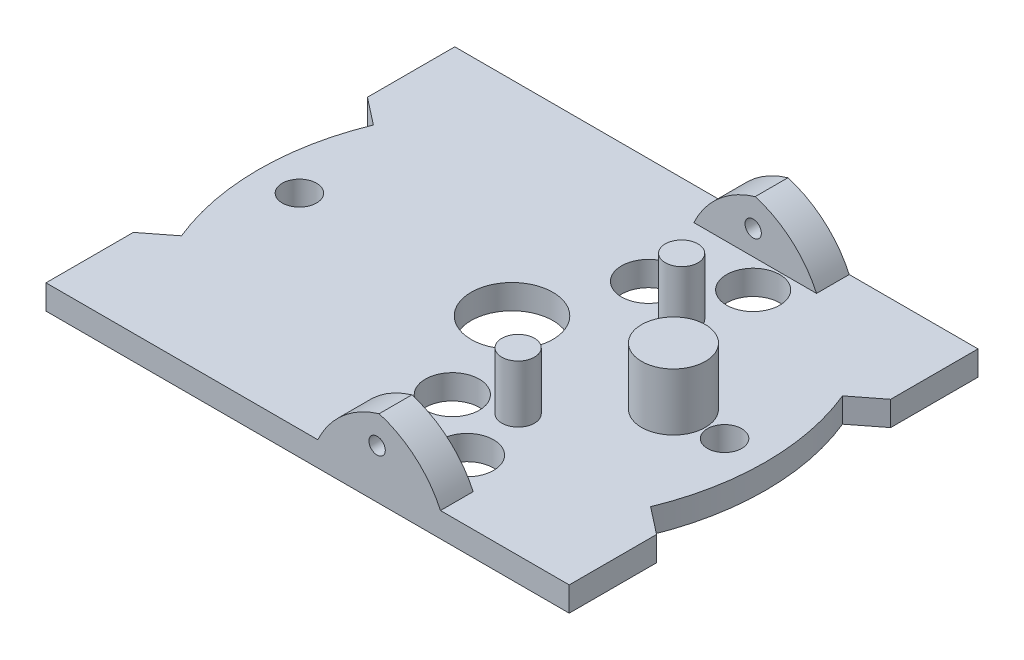
ISO-10303-21;
HEADER;
FILE_DESCRIPTION(('STEP AP214'),'2;1');
FILE_NAME('part.step','',(''),(''),'','','');
FILE_SCHEMA(('AUTOMOTIVE_DESIGN { 1 0 10303 214 1 1 1 1 }'));
ENDSEC;
DATA;
#1=APPLICATION_CONTEXT('core data for automotive mechanical design processes');
#2=APPLICATION_PROTOCOL_DEFINITION('international standard','automotive_design',2000,#1);
#3=PRODUCT_CONTEXT('',#1,'mechanical');
#4=PRODUCT('Part','Part','',(#3));
#5=PRODUCT_RELATED_PRODUCT_CATEGORY('part','',(#4));
#6=PRODUCT_DEFINITION_FORMATION('','',#4);
#7=PRODUCT_DEFINITION_CONTEXT('part definition',#1,'design');
#8=PRODUCT_DEFINITION('design','',#6,#7);
#9=PRODUCT_DEFINITION_SHAPE('','',#8);
#10=(LENGTH_UNIT() NAMED_UNIT(*) SI_UNIT(.MILLI.,.METRE.));
#11=(NAMED_UNIT(*) PLANE_ANGLE_UNIT() SI_UNIT($,.RADIAN.));
#12=(NAMED_UNIT(*) SI_UNIT($,.STERADIAN.) SOLID_ANGLE_UNIT());
#13=UNCERTAINTY_MEASURE_WITH_UNIT(LENGTH_MEASURE(1.E-05),#10,'distance_accuracy_value','');
#14=(GEOMETRIC_REPRESENTATION_CONTEXT(3) GLOBAL_UNCERTAINTY_ASSIGNED_CONTEXT((#13)) GLOBAL_UNIT_ASSIGNED_CONTEXT((#10,
#11,#12)) REPRESENTATION_CONTEXT('',''));
#15=CARTESIAN_POINT('',(0.,0.,0.));
#16=DIRECTION('',(0.,0.,1.));
#17=DIRECTION('',(1.,0.,0.));
#18=AXIS2_PLACEMENT_3D('',#15,#16,#17);
#19=CARTESIAN_POINT('',(0.,3.,0.));
#20=DIRECTION('',(0.,1.,0.));
#21=DIRECTION('',(0.,0.,1.));
#22=AXIS2_PLACEMENT_3D('',#19,#20,#21);
#23=PLANE('',#22);
#24=CARTESIAN_POINT('',(4.7,3.,-12.));
#25=DIRECTION('',(0.,1.,0.));
#26=DIRECTION('',(0.,0.,1.));
#27=AXIS2_PLACEMENT_3D('',#24,#25,#26);
#28=CIRCLE('',#27,3.3);
#29=CARTESIAN_POINT('',(4.7,3.,-8.69999999999999));
#30=VERTEX_POINT('',#29);
#31=EDGE_CURVE('E393',#30,#30,#28,.T.);
#32=ORIENTED_EDGE('',*,*,#31,.F.);
#33=EDGE_LOOP('',(#32));
#34=FACE_BOUND('',#33,.T.);
#35=CARTESIAN_POINT('',(4.7,3.,12.));
#36=DIRECTION('',(0.,1.,0.));
#37=DIRECTION('',(0.,0.,1.));
#38=AXIS2_PLACEMENT_3D('',#35,#36,#37);
#39=CIRCLE('',#38,3.3);
#40=CARTESIAN_POINT('',(4.7,3.,15.3));
#41=VERTEX_POINT('',#40);
#42=EDGE_CURVE('E389',#41,#41,#39,.F.);
#43=ORIENTED_EDGE('',*,*,#42,.T.);
#44=EDGE_LOOP('',(#43));
#45=FACE_BOUND('',#44,.T.);
#46=CARTESIAN_POINT('',(12.,3.,-17.5));
#47=DIRECTION('',(0.,1.,0.));
#48=DIRECTION('',(0.,0.,1.));
#49=AXIS2_PLACEMENT_3D('',#46,#47,#48);
#50=CIRCLE('',#49,3.25);
#51=CARTESIAN_POINT('',(12.,3.,-14.25));
#52=VERTEX_POINT('',#51);
#53=EDGE_CURVE('E350',#52,#52,#50,.T.);
#54=ORIENTED_EDGE('',*,*,#53,.F.);
#55=EDGE_LOOP('',(#54));
#56=FACE_BOUND('',#55,.T.);
#57=CARTESIAN_POINT('',(19.75,3.,0.));
#58=DIRECTION('',(0.,1.,0.));
#59=DIRECTION('',(0.,0.,1.));
#60=AXIS2_PLACEMENT_3D('',#57,#58,#59);
#61=CIRCLE('',#60,3.9);
#62=CARTESIAN_POINT('',(19.75,3.,3.9));
#63=VERTEX_POINT('',#62);
#64=EDGE_CURVE('E400',#63,#63,#61,.T.);
#65=ORIENTED_EDGE('',*,*,#64,.F.);
#66=EDGE_LOOP('',(#65));
#67=FACE_BOUND('',#66,.T.);
#68=CARTESIAN_POINT('',(10.75,3.,-10.));
#69=DIRECTION('',(0.,1.,0.));
#70=DIRECTION('',(0.,0.,1.));
#71=AXIS2_PLACEMENT_3D('',#68,#69,#70);
#72=CIRCLE('',#71,2.);
#73=CARTESIAN_POINT('',(10.75,3.,-8.));
#74=VERTEX_POINT('',#73);
#75=EDGE_CURVE('E221',#74,#74,#72,.T.);
#76=ORIENTED_EDGE('',*,*,#75,.F.);
#77=EDGE_LOOP('',(#76));
#78=FACE_BOUND('',#77,.T.);
#79=CARTESIAN_POINT('',(10.75,3.,9.99999999999999));
#80=DIRECTION('',(0.,1.,0.));
#81=DIRECTION('',(0.,0.,1.));
#82=AXIS2_PLACEMENT_3D('',#79,#80,#81);
#83=CIRCLE('',#82,2.);
#84=CARTESIAN_POINT('',(10.75,3.,12.));
#85=VERTEX_POINT('',#84);
#86=EDGE_CURVE('E340',#85,#85,#83,.T.);
#87=ORIENTED_EDGE('',*,*,#86,.F.);
#88=EDGE_LOOP('',(#87));
#89=FACE_BOUND('',#88,.T.);
#90=CARTESIAN_POINT('',(0.,3.,0.));
#91=DIRECTION('',(0.,1.,0.));
#92=DIRECTION('',(0.,0.,1.));
#93=AXIS2_PLACEMENT_3D('',#90,#91,#92);
#94=CIRCLE('',#93,5.);
#95=CARTESIAN_POINT('',(0.,3.,5.));
#96=VERTEX_POINT('',#95);
#97=EDGE_CURVE('E236',#96,#96,#94,.F.);
#98=ORIENTED_EDGE('',*,*,#97,.T.);
#99=EDGE_LOOP('',(#98));
#100=FACE_BOUND('',#99,.T.);
#101=CARTESIAN_POINT('',(-26.,3.,0.));
#102=DIRECTION('',(0.,1.,0.));
#103=DIRECTION('',(0.,0.,1.));
#104=AXIS2_PLACEMENT_3D('',#101,#102,#103);
#105=CIRCLE('',#104,2.1);
#106=CARTESIAN_POINT('',(-26.,3.,2.10000000000001));
#107=VERTEX_POINT('',#106);
#108=EDGE_CURVE('E268',#107,#107,#105,.T.);
#109=ORIENTED_EDGE('',*,*,#108,.F.);
#110=EDGE_LOOP('',(#109));
#111=FACE_BOUND('',#110,.T.);
#112=CARTESIAN_POINT('',(26.,3.,0.));
#113=DIRECTION('',(0.,1.,0.));
#114=DIRECTION('',(0.,0.,1.));
#115=AXIS2_PLACEMENT_3D('',#112,#113,#114);
#116=CIRCLE('',#115,2.1);
#117=CARTESIAN_POINT('',(26.,3.,2.09999999999999));
#118=VERTEX_POINT('',#117);
#119=EDGE_CURVE('E271',#118,#118,#116,.F.);
#120=ORIENTED_EDGE('',*,*,#119,.T.);
#121=EDGE_LOOP('',(#120));
#122=FACE_BOUND('',#121,.T.);
#123=DIRECTION('',(-1.,0.,0.));
#124=VECTOR('',#123,1.);
#125=CARTESIAN_POINT('',(0.,3.,25.));
#126=LINE('',#125,#124);
#127=CARTESIAN_POINT('',(1.25,3.,25.));
#128=VERTEX_POINT('',#127);
#129=CARTESIAN_POINT('',(-32.,3.,25.));
#130=VERTEX_POINT('',#129);
#131=EDGE_CURVE('E240',#128,#130,#126,.T.);
#132=ORIENTED_EDGE('',*,*,#131,.F.);
#133=DIRECTION('',(0.,0.,1.));
#134=VECTOR('',#133,1.);
#135=CARTESIAN_POINT('',(1.25,3.,0.));
#136=LINE('',#135,#134);
#137=CARTESIAN_POINT('',(1.25,3.,21.));
#138=VERTEX_POINT('',#137);
#139=EDGE_CURVE('E214',#138,#128,#136,.T.);
#140=ORIENTED_EDGE('',*,*,#139,.F.);
#141=DIRECTION('',(-1.,0.,0.));
#142=VECTOR('',#141,1.);
#143=CARTESIAN_POINT('',(0.,3.,21.));
#144=LINE('',#143,#142);
#145=CARTESIAN_POINT('',(16.25,3.,21.));
#146=VERTEX_POINT('',#145);
#147=EDGE_CURVE('E201',#146,#138,#144,.T.);
#148=ORIENTED_EDGE('',*,*,#147,.F.);
#149=DIRECTION('',(0.,0.,1.));
#150=VECTOR('',#149,1.);
#151=CARTESIAN_POINT('',(16.25,3.,0.));
#152=LINE('',#151,#150);
#153=CARTESIAN_POINT('',(16.25,3.,25.));
#154=VERTEX_POINT('',#153);
#155=EDGE_CURVE('E212',#146,#154,#152,.T.);
#156=ORIENTED_EDGE('',*,*,#155,.T.);
#157=CARTESIAN_POINT('',(32.,3.,25.));
#158=VERTEX_POINT('',#157);
#159=EDGE_CURVE('E237',#158,#154,#126,.T.);
#160=ORIENTED_EDGE('',*,*,#159,.F.);
#161=DIRECTION('',(0.,0.,-1.));
#162=VECTOR('',#161,1.);
#163=CARTESIAN_POINT('',(32.,3.,0.));
#164=LINE('',#163,#162);
#165=CARTESIAN_POINT('',(32.,3.,14.320549046737));
#166=VERTEX_POINT('',#165);
#167=EDGE_CURVE('E239',#158,#166,#164,.T.);
#168=ORIENTED_EDGE('',*,*,#167,.T.);
#169=DIRECTION('',(0.788024373724563,0.,0.615644041972315));
#170=VECTOR('',#169,1.);
#171=CARTESIAN_POINT('',(5.18105564742899,3.,-6.63175122870911));
#172=LINE('',#171,#170);
#173=CARTESIAN_POINT('',(28.6924140746813,3.,11.7364975425818));
#174=VERTEX_POINT('',#173);
#175=EDGE_CURVE('E242',#174,#166,#172,.T.);
#176=ORIENTED_EDGE('',*,*,#175,.F.);
#177=CARTESIAN_POINT('',(0.,3.,0.));
#178=DIRECTION('',(0.,1.,0.));
#179=DIRECTION('',(0.,0.,1.));
#180=AXIS2_PLACEMENT_3D('',#177,#178,#179);
#181=CIRCLE('',#180,31.);
#182=CARTESIAN_POINT('',(28.6924140746813,3.,-11.7364975425818));
#183=VERTEX_POINT('',#182);
#184=EDGE_CURVE('E245',#174,#183,#181,.T.);
#185=ORIENTED_EDGE('',*,*,#184,.T.);
#186=DIRECTION('',(0.788024373724563,0.,-0.615644041972316));
#187=VECTOR('',#186,1.);
#188=CARTESIAN_POINT('',(5.18105564742899,3.,6.6317512287091));
#189=LINE('',#188,#187);
#190=CARTESIAN_POINT('',(32.,3.,-14.320549046737));
#191=VERTEX_POINT('',#190);
#192=EDGE_CURVE('E247',#183,#191,#189,.T.);
#193=ORIENTED_EDGE('',*,*,#192,.T.);
#194=DIRECTION('',(0.,0.,-1.));
#195=VECTOR('',#194,1.);
#196=CARTESIAN_POINT('',(32.,3.,0.));
#197=LINE('',#196,#195);
#198=CARTESIAN_POINT('',(32.,3.,-25.));
#199=VERTEX_POINT('',#198);
#200=EDGE_CURVE('E249',#191,#199,#197,.T.);
#201=ORIENTED_EDGE('',*,*,#200,.T.);
#202=DIRECTION('',(-1.,0.,0.));
#203=VECTOR('',#202,1.);
#204=CARTESIAN_POINT('',(0.,3.,-25.));
#205=LINE('',#204,#203);
#206=CARTESIAN_POINT('',(16.25,3.,-25.));
#207=VERTEX_POINT('',#206);
#208=EDGE_CURVE('E252',#199,#207,#205,.T.);
#209=ORIENTED_EDGE('',*,*,#208,.T.);
#210=DIRECTION('',(0.,0.,-1.));
#211=VECTOR('',#210,1.);
#212=CARTESIAN_POINT('',(16.25,3.,0.));
#213=LINE('',#212,#211);
#214=CARTESIAN_POINT('',(16.25,3.,-21.));
#215=VERTEX_POINT('',#214);
#216=EDGE_CURVE('E230',#215,#207,#213,.T.);
#217=ORIENTED_EDGE('',*,*,#216,.F.);
#218=DIRECTION('',(-1.,0.,0.));
#219=VECTOR('',#218,1.);
#220=CARTESIAN_POINT('',(0.,3.,-21.));
#221=LINE('',#220,#219);
#222=CARTESIAN_POINT('',(1.25,3.,-21.));
#223=VERTEX_POINT('',#222);
#224=EDGE_CURVE('E227',#215,#223,#221,.T.);
#225=ORIENTED_EDGE('',*,*,#224,.T.);
#226=DIRECTION('',(0.,0.,-1.));
#227=VECTOR('',#226,1.);
#228=CARTESIAN_POINT('',(1.25,3.,0.));
#229=LINE('',#228,#227);
#230=CARTESIAN_POINT('',(1.25,3.,-25.));
#231=VERTEX_POINT('',#230);
#232=EDGE_CURVE('E215',#223,#231,#229,.T.);
#233=ORIENTED_EDGE('',*,*,#232,.T.);
#234=CARTESIAN_POINT('',(-32.,3.,-25.));
#235=VERTEX_POINT('',#234);
#236=EDGE_CURVE('E251',#231,#235,#205,.T.);
#237=ORIENTED_EDGE('',*,*,#236,.T.);
#238=DIRECTION('',(0.,0.,-1.));
#239=VECTOR('',#238,1.);
#240=CARTESIAN_POINT('',(-32.,3.,0.));
#241=LINE('',#240,#239);
#242=CARTESIAN_POINT('',(-32.,3.,-14.320549046737));
#243=VERTEX_POINT('',#242);
#244=EDGE_CURVE('E255',#243,#235,#241,.T.);
#245=ORIENTED_EDGE('',*,*,#244,.F.);
#246=DIRECTION('',(-0.788024373724563,0.,-0.615644041972316));
#247=VECTOR('',#246,1.);
#248=CARTESIAN_POINT('',(-5.181055647429,3.,6.63175122870911));
#249=LINE('',#248,#247);
#250=CARTESIAN_POINT('',(-28.6924140746813,3.,-11.7364975425818));
#251=VERTEX_POINT('',#250);
#252=EDGE_CURVE('E258',#251,#243,#249,.T.);
#253=ORIENTED_EDGE('',*,*,#252,.F.);
#254=CARTESIAN_POINT('',(0.,3.,0.));
#255=DIRECTION('',(0.,1.,0.));
#256=DIRECTION('',(0.,0.,1.));
#257=AXIS2_PLACEMENT_3D('',#254,#255,#256);
#258=CIRCLE('',#257,31.);
#259=CARTESIAN_POINT('',(-28.6924140746813,3.,11.7364975425818));
#260=VERTEX_POINT('',#259);
#261=EDGE_CURVE('E261',#251,#260,#258,.T.);
#262=ORIENTED_EDGE('',*,*,#261,.T.);
#263=DIRECTION('',(-0.788024373724563,0.,0.615644041972316));
#264=VECTOR('',#263,1.);
#265=CARTESIAN_POINT('',(-5.181055647429,3.,-6.63175122870911));
#266=LINE('',#265,#264);
#267=CARTESIAN_POINT('',(-32.,3.,14.320549046737));
#268=VERTEX_POINT('',#267);
#269=EDGE_CURVE('E263',#260,#268,#266,.T.);
#270=ORIENTED_EDGE('',*,*,#269,.T.);
#271=DIRECTION('',(0.,0.,-1.));
#272=VECTOR('',#271,1.);
#273=CARTESIAN_POINT('',(-32.,3.,0.));
#274=LINE('',#273,#272);
#275=EDGE_CURVE('E265',#130,#268,#274,.T.);
#276=ORIENTED_EDGE('',*,*,#275,.F.);
#277=EDGE_LOOP('',(#132,#140,#148,#156,#160,#168,#176,#185,#193,#201,#209,#217,#225,#233,#237,
#245,#253,#262,#270,#276));
#278=FACE_BOUND('',#277,.T.);
#279=CARTESIAN_POINT('',(12.,3.,17.5));
#280=DIRECTION('',(0.,1.,0.));
#281=DIRECTION('',(0.,0.,1.));
#282=AXIS2_PLACEMENT_3D('',#279,#280,#281);
#283=CIRCLE('',#282,3.25);
#284=CARTESIAN_POINT('',(12.,3.,20.75));
#285=VERTEX_POINT('',#284);
#286=EDGE_CURVE('E392',#285,#285,#283,.F.);
#287=ORIENTED_EDGE('',*,*,#286,.T.);
#288=EDGE_LOOP('',(#287));
#289=FACE_BOUND('',#288,.T.);
#290=ADVANCED_FACE('F76',(#34,#45,#56,#67,#78,#89,#100,#111,#122,#278,#289),#23,.T.);
#291=CARTESIAN_POINT('',(0.,0.,0.));
#292=DIRECTION('',(0.,1.,0.));
#293=DIRECTION('',(0.,0.,1.));
#294=AXIS2_PLACEMENT_3D('',#291,#292,#293);
#295=PLANE('',#294);
#296=CARTESIAN_POINT('',(4.7,0.,-12.));
#297=DIRECTION('',(0.,1.,0.));
#298=DIRECTION('',(0.,0.,1.));
#299=AXIS2_PLACEMENT_3D('',#296,#297,#298);
#300=CIRCLE('',#299,3.3);
#301=CARTESIAN_POINT('',(4.7,0.,-8.69999999999999));
#302=VERTEX_POINT('',#301);
#303=EDGE_CURVE('E356',#302,#302,#300,.T.);
#304=ORIENTED_EDGE('',*,*,#303,.T.);
#305=EDGE_LOOP('',(#304));
#306=FACE_BOUND('',#305,.T.);
#307=CARTESIAN_POINT('',(12.,0.,-17.5));
#308=DIRECTION('',(0.,1.,0.));
#309=DIRECTION('',(0.,0.,1.));
#310=AXIS2_PLACEMENT_3D('',#307,#308,#309);
#311=CIRCLE('',#310,3.25);
#312=CARTESIAN_POINT('',(12.,0.,-14.25));
#313=VERTEX_POINT('',#312);
#314=EDGE_CURVE('E346',#313,#313,#311,.T.);
#315=ORIENTED_EDGE('',*,*,#314,.T.);
#316=EDGE_LOOP('',(#315));
#317=FACE_BOUND('',#316,.T.);
#318=CARTESIAN_POINT('',(0.,0.,0.));
#319=DIRECTION('',(0.,1.,0.));
#320=DIRECTION('',(0.,0.,1.));
#321=AXIS2_PLACEMENT_3D('',#318,#319,#320);
#322=CIRCLE('',#321,5.);
#323=CARTESIAN_POINT('',(0.,0.,5.));
#324=VERTEX_POINT('',#323);
#325=EDGE_CURVE('E233',#324,#324,#322,.T.);
#326=ORIENTED_EDGE('',*,*,#325,.T.);
#327=EDGE_LOOP('',(#326));
#328=FACE_BOUND('',#327,.T.);
#329=DIRECTION('',(-1.,0.,0.));
#330=VECTOR('',#329,1.);
#331=CARTESIAN_POINT('',(0.,0.,25.));
#332=LINE('',#331,#330);
#333=CARTESIAN_POINT('',(32.,0.,25.));
#334=VERTEX_POINT('',#333);
#335=CARTESIAN_POINT('',(-32.,0.,25.));
#336=VERTEX_POINT('',#335);
#337=EDGE_CURVE('E275',#334,#336,#332,.T.);
#338=ORIENTED_EDGE('',*,*,#337,.T.);
#339=DIRECTION('',(0.,0.,-1.));
#340=VECTOR('',#339,1.);
#341=CARTESIAN_POINT('',(-32.,0.,0.));
#342=LINE('',#341,#340);
#343=CARTESIAN_POINT('',(-32.,0.,14.320549046737));
#344=VERTEX_POINT('',#343);
#345=EDGE_CURVE('E304',#336,#344,#342,.T.);
#346=ORIENTED_EDGE('',*,*,#345,.T.);
#347=DIRECTION('',(-0.788024373724563,0.,0.615644041972316));
#348=VECTOR('',#347,1.);
#349=CARTESIAN_POINT('',(-5.181055647429,0.,-6.63175122870911));
#350=LINE('',#349,#348);
#351=CARTESIAN_POINT('',(-28.6924140746813,0.,11.7364975425818));
#352=VERTEX_POINT('',#351);
#353=EDGE_CURVE('E301',#352,#344,#350,.T.);
#354=ORIENTED_EDGE('',*,*,#353,.F.);
#355=CARTESIAN_POINT('',(0.,0.,0.));
#356=DIRECTION('',(0.,1.,0.));
#357=DIRECTION('',(0.,0.,1.));
#358=AXIS2_PLACEMENT_3D('',#355,#356,#357);
#359=CIRCLE('',#358,31.);
#360=CARTESIAN_POINT('',(-28.6924140746813,0.,-11.7364975425818));
#361=VERTEX_POINT('',#360);
#362=EDGE_CURVE('E299',#361,#352,#359,.T.);
#363=ORIENTED_EDGE('',*,*,#362,.F.);
#364=DIRECTION('',(-0.788024373724563,0.,-0.615644041972316));
#365=VECTOR('',#364,1.);
#366=CARTESIAN_POINT('',(-5.181055647429,0.,6.63175122870911));
#367=LINE('',#366,#365);
#368=CARTESIAN_POINT('',(-32.,0.,-14.320549046737));
#369=VERTEX_POINT('',#368);
#370=EDGE_CURVE('E296',#361,#369,#367,.T.);
#371=ORIENTED_EDGE('',*,*,#370,.T.);
#372=DIRECTION('',(0.,0.,-1.));
#373=VECTOR('',#372,1.);
#374=CARTESIAN_POINT('',(-32.,0.,0.));
#375=LINE('',#374,#373);
#376=CARTESIAN_POINT('',(-32.,0.,-25.));
#377=VERTEX_POINT('',#376);
#378=EDGE_CURVE('E293',#369,#377,#375,.T.);
#379=ORIENTED_EDGE('',*,*,#378,.T.);
#380=DIRECTION('',(-1.,0.,0.));
#381=VECTOR('',#380,1.);
#382=CARTESIAN_POINT('',(0.,0.,-25.));
#383=LINE('',#382,#381);
#384=CARTESIAN_POINT('',(32.,0.,-25.));
#385=VERTEX_POINT('',#384);
#386=EDGE_CURVE('E290',#385,#377,#383,.T.);
#387=ORIENTED_EDGE('',*,*,#386,.F.);
#388=DIRECTION('',(0.,0.,-1.));
#389=VECTOR('',#388,1.);
#390=CARTESIAN_POINT('',(32.,0.,0.));
#391=LINE('',#390,#389);
#392=CARTESIAN_POINT('',(32.,0.,-14.320549046737));
#393=VERTEX_POINT('',#392);
#394=EDGE_CURVE('E288',#393,#385,#391,.T.);
#395=ORIENTED_EDGE('',*,*,#394,.F.);
#396=DIRECTION('',(0.788024373724563,0.,-0.615644041972316));
#397=VECTOR('',#396,1.);
#398=CARTESIAN_POINT('',(5.18105564742899,0.,6.6317512287091));
#399=LINE('',#398,#397);
#400=CARTESIAN_POINT('',(28.6924140746813,0.,-11.7364975425818));
#401=VERTEX_POINT('',#400);
#402=EDGE_CURVE('E286',#401,#393,#399,.T.);
#403=ORIENTED_EDGE('',*,*,#402,.F.);
#404=CARTESIAN_POINT('',(0.,0.,0.));
#405=DIRECTION('',(0.,1.,0.));
#406=DIRECTION('',(0.,0.,1.));
#407=AXIS2_PLACEMENT_3D('',#404,#405,#406);
#408=CIRCLE('',#407,31.);
#409=CARTESIAN_POINT('',(28.6924140746813,0.,11.7364975425818));
#410=VERTEX_POINT('',#409);
#411=EDGE_CURVE('E284',#410,#401,#408,.T.);
#412=ORIENTED_EDGE('',*,*,#411,.F.);
#413=DIRECTION('',(0.788024373724563,0.,0.615644041972315));
#414=VECTOR('',#413,1.);
#415=CARTESIAN_POINT('',(5.18105564742899,0.,-6.63175122870911));
#416=LINE('',#415,#414);
#417=CARTESIAN_POINT('',(32.,0.,14.320549046737));
#418=VERTEX_POINT('',#417);
#419=EDGE_CURVE('E281',#410,#418,#416,.T.);
#420=ORIENTED_EDGE('',*,*,#419,.T.);
#421=DIRECTION('',(0.,0.,-1.));
#422=VECTOR('',#421,1.);
#423=CARTESIAN_POINT('',(32.,0.,0.));
#424=LINE('',#423,#422);
#425=EDGE_CURVE('E278',#334,#418,#424,.T.);
#426=ORIENTED_EDGE('',*,*,#425,.F.);
#427=EDGE_LOOP('',(#338,#346,#354,#363,#371,#379,#387,#395,#403,#412,#420,#426));
#428=FACE_BOUND('',#427,.T.);
#429=CARTESIAN_POINT('',(-26.,0.,0.));
#430=DIRECTION('',(0.,1.,0.));
#431=DIRECTION('',(0.,0.,1.));
#432=AXIS2_PLACEMENT_3D('',#429,#430,#431);
#433=CIRCLE('',#432,2.1);
#434=CARTESIAN_POINT('',(-26.,0.,2.10000000000001));
#435=VERTEX_POINT('',#434);
#436=EDGE_CURVE('E307',#435,#435,#433,.T.);
#437=ORIENTED_EDGE('',*,*,#436,.T.);
#438=EDGE_LOOP('',(#437));
#439=FACE_BOUND('',#438,.T.);
#440=CARTESIAN_POINT('',(26.,0.,0.));
#441=DIRECTION('',(0.,1.,0.));
#442=DIRECTION('',(0.,0.,1.));
#443=AXIS2_PLACEMENT_3D('',#440,#441,#442);
#444=CIRCLE('',#443,2.1);
#445=CARTESIAN_POINT('',(26.,0.,2.09999999999999));
#446=VERTEX_POINT('',#445);
#447=EDGE_CURVE('E310',#446,#446,#444,.F.);
#448=ORIENTED_EDGE('',*,*,#447,.F.);
#449=EDGE_LOOP('',(#448));
#450=FACE_BOUND('',#449,.T.);
#451=CARTESIAN_POINT('',(4.7,0.,12.));
#452=DIRECTION('',(0.,1.,0.));
#453=DIRECTION('',(0.,0.,1.));
#454=AXIS2_PLACEMENT_3D('',#451,#452,#453);
#455=CIRCLE('',#454,3.3);
#456=CARTESIAN_POINT('',(4.7,0.,15.3));
#457=VERTEX_POINT('',#456);
#458=EDGE_CURVE('E349',#457,#457,#455,.F.);
#459=ORIENTED_EDGE('',*,*,#458,.F.);
#460=EDGE_LOOP('',(#459));
#461=FACE_BOUND('',#460,.T.);
#462=CARTESIAN_POINT('',(12.,0.,17.5));
#463=DIRECTION('',(0.,1.,0.));
#464=DIRECTION('',(0.,0.,1.));
#465=AXIS2_PLACEMENT_3D('',#462,#463,#464);
#466=CIRCLE('',#465,3.25);
#467=CARTESIAN_POINT('',(12.,0.,20.75));
#468=VERTEX_POINT('',#467);
#469=EDGE_CURVE('E353',#468,#468,#466,.F.);
#470=ORIENTED_EDGE('',*,*,#469,.F.);
#471=EDGE_LOOP('',(#470));
#472=FACE_BOUND('',#471,.T.);
#473=ADVANCED_FACE('F421',(#306,#317,#328,#428,#439,#450,#461,#472),#295,.F.);
#474=CARTESIAN_POINT('',(26.,3.,0.));
#475=DIRECTION('',(0.,-1.,0.));
#476=DIRECTION('',(0.,0.,-1.));
#477=AXIS2_PLACEMENT_3D('',#474,#475,#476);
#478=CYLINDRICAL_SURFACE('',#477,2.1);
#479=ORIENTED_EDGE('',*,*,#119,.F.);
#480=EDGE_LOOP('',(#479));
#481=FACE_BOUND('',#480,.T.);
#482=ORIENTED_EDGE('',*,*,#447,.T.);
#483=EDGE_LOOP('',(#482));
#484=FACE_BOUND('',#483,.T.);
#485=ADVANCED_FACE('F432',(#481,#484),#478,.F.);
#486=CARTESIAN_POINT('',(-26.,3.,0.));
#487=DIRECTION('',(0.,-1.,0.));
#488=DIRECTION('',(0.,0.,-1.));
#489=AXIS2_PLACEMENT_3D('',#486,#487,#488);
#490=CYLINDRICAL_SURFACE('',#489,2.1);
#491=ORIENTED_EDGE('',*,*,#108,.T.);
#492=EDGE_LOOP('',(#491));
#493=FACE_BOUND('',#492,.T.);
#494=ORIENTED_EDGE('',*,*,#436,.F.);
#495=EDGE_LOOP('',(#494));
#496=FACE_BOUND('',#495,.T.);
#497=ADVANCED_FACE('F435',(#493,#496),#490,.F.);
#498=CARTESIAN_POINT('',(32.,3.,0.));
#499=DIRECTION('',(-1.,0.,0.));
#500=DIRECTION('',(0.,0.,1.));
#501=AXIS2_PLACEMENT_3D('',#498,#499,#500);
#502=PLANE('',#501);
#503=ORIENTED_EDGE('',*,*,#425,.T.);
#504=DIRECTION('',(0.,-1.,0.));
#505=VECTOR('',#504,1.);
#506=CARTESIAN_POINT('',(32.,3.,14.320549046737));
#507=LINE('',#506,#505);
#508=EDGE_CURVE('E336',#166,#418,#507,.T.);
#509=ORIENTED_EDGE('',*,*,#508,.F.);
#510=ORIENTED_EDGE('',*,*,#167,.F.);
#511=DIRECTION('',(0.,-1.,0.));
#512=VECTOR('',#511,1.);
#513=CARTESIAN_POINT('',(32.,3.,25.));
#514=LINE('',#513,#512);
#515=EDGE_CURVE('E338',#158,#334,#514,.T.);
#516=ORIENTED_EDGE('',*,*,#515,.T.);
#517=EDGE_LOOP('',(#503,#509,#510,#516));
#518=FACE_BOUND('',#517,.T.);
#519=ADVANCED_FACE('F498',(#518),#502,.F.);
#520=CARTESIAN_POINT('',(5.18105564742899,3.,-6.63175122870911));
#521=DIRECTION('',(0.615644041972315,0.,-0.788024373724563));
#522=DIRECTION('',(-0.788024373724563,0.,-0.615644041972315));
#523=AXIS2_PLACEMENT_3D('',#520,#521,#522);
#524=PLANE('',#523);
#525=ORIENTED_EDGE('',*,*,#419,.F.);
#526=DIRECTION('',(0.,-1.,0.));
#527=VECTOR('',#526,1.);
#528=CARTESIAN_POINT('',(28.6924140746813,3.,11.7364975425818));
#529=LINE('',#528,#527);
#530=EDGE_CURVE('E334',#174,#410,#529,.T.);
#531=ORIENTED_EDGE('',*,*,#530,.F.);
#532=ORIENTED_EDGE('',*,*,#175,.T.);
#533=ORIENTED_EDGE('',*,*,#508,.T.);
#534=EDGE_LOOP('',(#525,#531,#532,#533));
#535=FACE_BOUND('',#534,.T.);
#536=ADVANCED_FACE('F534',(#535),#524,.T.);
#537=CARTESIAN_POINT('',(0.,3.,0.));
#538=DIRECTION('',(0.,-1.,0.));
#539=DIRECTION('',(0.,0.,-1.));
#540=AXIS2_PLACEMENT_3D('',#537,#538,#539);
#541=CYLINDRICAL_SURFACE('',#540,31.);
#542=ORIENTED_EDGE('',*,*,#411,.T.);
#543=DIRECTION('',(0.,-1.,0.));
#544=VECTOR('',#543,1.);
#545=CARTESIAN_POINT('',(28.6924140746813,3.,-11.7364975425818));
#546=LINE('',#545,#544);
#547=EDGE_CURVE('E331',#183,#401,#546,.T.);
#548=ORIENTED_EDGE('',*,*,#547,.F.);
#549=ORIENTED_EDGE('',*,*,#184,.F.);
#550=ORIENTED_EDGE('',*,*,#530,.T.);
#551=EDGE_LOOP('',(#542,#548,#549,#550));
#552=FACE_BOUND('',#551,.T.);
#553=ADVANCED_FACE('F530',(#552),#541,.T.);
#554=CARTESIAN_POINT('',(5.18105564742899,3.,6.6317512287091));
#555=DIRECTION('',(-0.615644041972315,0.,-0.788024373724563));
#556=DIRECTION('',(-0.788024373724563,0.,0.615644041972316));
#557=AXIS2_PLACEMENT_3D('',#554,#555,#556);
#558=PLANE('',#557);
#559=ORIENTED_EDGE('',*,*,#402,.T.);
#560=DIRECTION('',(0.,-1.,0.));
#561=VECTOR('',#560,1.);
#562=CARTESIAN_POINT('',(32.,3.,-14.320549046737));
#563=LINE('',#562,#561);
#564=EDGE_CURVE('E328',#191,#393,#563,.T.);
#565=ORIENTED_EDGE('',*,*,#564,.F.);
#566=ORIENTED_EDGE('',*,*,#192,.F.);
#567=ORIENTED_EDGE('',*,*,#547,.T.);
#568=EDGE_LOOP('',(#559,#565,#566,#567));
#569=FACE_BOUND('',#568,.T.);
#570=ADVANCED_FACE('F526',(#569),#558,.F.);
#571=CARTESIAN_POINT('',(32.,3.,0.));
#572=DIRECTION('',(-1.,0.,0.));
#573=DIRECTION('',(0.,0.,1.));
#574=AXIS2_PLACEMENT_3D('',#571,#572,#573);
#575=PLANE('',#574);
#576=ORIENTED_EDGE('',*,*,#394,.T.);
#577=DIRECTION('',(0.,-1.,0.));
#578=VECTOR('',#577,1.);
#579=CARTESIAN_POINT('',(32.,3.,-25.));
#580=LINE('',#579,#578);
#581=EDGE_CURVE('E325',#199,#385,#580,.T.);
#582=ORIENTED_EDGE('',*,*,#581,.F.);
#583=ORIENTED_EDGE('',*,*,#200,.F.);
#584=ORIENTED_EDGE('',*,*,#564,.T.);
#585=EDGE_LOOP('',(#576,#582,#583,#584));
#586=FACE_BOUND('',#585,.T.);
#587=ADVANCED_FACE('F523',(#586),#575,.F.);
#588=CARTESIAN_POINT('',(0.,3.,-25.));
#589=DIRECTION('',(0.,0.,1.));
#590=DIRECTION('',(1.,0.,0.));
#591=AXIS2_PLACEMENT_3D('',#588,#589,#590);
#592=PLANE('',#591);
#593=CARTESIAN_POINT('',(8.50000000000002,6.,-25.));
#594=DIRECTION('',(0.,0.,1.));
#595=DIRECTION('',(1.,0.,0.));
#596=AXIS2_PLACEMENT_3D('',#593,#594,#595);
#597=CIRCLE('',#596,1.);
#598=CARTESIAN_POINT('',(9.50000000000002,6.,-25.));
#599=VERTEX_POINT('',#598);
#600=EDGE_CURVE('E379',#599,#599,#597,.T.);
#601=ORIENTED_EDGE('',*,*,#600,.T.);
#602=EDGE_LOOP('',(#601));
#603=FACE_BOUND('',#602,.T.);
#604=ORIENTED_EDGE('',*,*,#236,.F.);
#605=CARTESIAN_POINT('',(12.1587121146357,-2.,-25.));
#606=DIRECTION('',(0.,0.,1.));
#607=DIRECTION('',(1.,0.,0.));
#608=AXIS2_PLACEMENT_3D('',#605,#606,#607);
#609=CIRCLE('',#608,12.);
#610=CARTESIAN_POINT('',(8.75,9.50568041097682,-25.));
#611=VERTEX_POINT('',#610);
#612=EDGE_CURVE('E366',#231,#611,#609,.F.);
#613=ORIENTED_EDGE('',*,*,#612,.T.);
#614=CARTESIAN_POINT('',(5.34128788536429,-2.,-25.));
#615=DIRECTION('',(0.,0.,1.));
#616=DIRECTION('',(1.,0.,0.));
#617=AXIS2_PLACEMENT_3D('',#614,#615,#616);
#618=CIRCLE('',#617,12.);
#619=EDGE_CURVE('E345',#611,#207,#618,.F.);
#620=ORIENTED_EDGE('',*,*,#619,.T.);
#621=ORIENTED_EDGE('',*,*,#208,.F.);
#622=ORIENTED_EDGE('',*,*,#581,.T.);
#623=ORIENTED_EDGE('',*,*,#386,.T.);
#624=DIRECTION('',(0.,-1.,0.));
#625=VECTOR('',#624,1.);
#626=CARTESIAN_POINT('',(-32.,3.,-25.));
#627=LINE('',#626,#625);
#628=EDGE_CURVE('E323',#235,#377,#627,.T.);
#629=ORIENTED_EDGE('',*,*,#628,.F.);
#630=EDGE_LOOP('',(#604,#613,#620,#621,#622,#623,#629));
#631=FACE_BOUND('',#630,.T.);
#632=ADVANCED_FACE('F519',(#603,#631),#592,.F.);
#633=CARTESIAN_POINT('',(-32.,3.,0.));
#634=DIRECTION('',(-1.,0.,0.));
#635=DIRECTION('',(0.,0.,1.));
#636=AXIS2_PLACEMENT_3D('',#633,#634,#635);
#637=PLANE('',#636);
#638=ORIENTED_EDGE('',*,*,#378,.F.);
#639=DIRECTION('',(0.,-1.,0.));
#640=VECTOR('',#639,1.);
#641=CARTESIAN_POINT('',(-32.,3.,-14.320549046737));
#642=LINE('',#641,#640);
#643=EDGE_CURVE('E321',#243,#369,#642,.T.);
#644=ORIENTED_EDGE('',*,*,#643,.F.);
#645=ORIENTED_EDGE('',*,*,#244,.T.);
#646=ORIENTED_EDGE('',*,*,#628,.T.);
#647=EDGE_LOOP('',(#638,#644,#645,#646));
#648=FACE_BOUND('',#647,.T.);
#649=ADVANCED_FACE('F515',(#648),#637,.T.);
#650=CARTESIAN_POINT('',(-5.181055647429,3.,6.63175122870911));
#651=DIRECTION('',(-0.615644041972315,0.,0.788024373724563));
#652=DIRECTION('',(0.788024373724563,0.,0.615644041972316));
#653=AXIS2_PLACEMENT_3D('',#650,#651,#652);
#654=PLANE('',#653);
#655=ORIENTED_EDGE('',*,*,#370,.F.);
#656=DIRECTION('',(0.,-1.,0.));
#657=VECTOR('',#656,1.);
#658=CARTESIAN_POINT('',(-28.6924140746813,3.,-11.7364975425818));
#659=LINE('',#658,#657);
#660=EDGE_CURVE('E319',#251,#361,#659,.T.);
#661=ORIENTED_EDGE('',*,*,#660,.F.);
#662=ORIENTED_EDGE('',*,*,#252,.T.);
#663=ORIENTED_EDGE('',*,*,#643,.T.);
#664=EDGE_LOOP('',(#655,#661,#662,#663));
#665=FACE_BOUND('',#664,.T.);
#666=ADVANCED_FACE('F511',(#665),#654,.T.);
#667=CARTESIAN_POINT('',(0.,3.,0.));
#668=DIRECTION('',(0.,-1.,0.));
#669=DIRECTION('',(0.,0.,-1.));
#670=AXIS2_PLACEMENT_3D('',#667,#668,#669);
#671=CYLINDRICAL_SURFACE('',#670,31.);
#672=ORIENTED_EDGE('',*,*,#362,.T.);
#673=DIRECTION('',(0.,-1.,0.));
#674=VECTOR('',#673,1.);
#675=CARTESIAN_POINT('',(-28.6924140746813,3.,11.7364975425818));
#676=LINE('',#675,#674);
#677=EDGE_CURVE('E316',#260,#352,#676,.T.);
#678=ORIENTED_EDGE('',*,*,#677,.F.);
#679=ORIENTED_EDGE('',*,*,#261,.F.);
#680=ORIENTED_EDGE('',*,*,#660,.T.);
#681=EDGE_LOOP('',(#672,#678,#679,#680));
#682=FACE_BOUND('',#681,.T.);
#683=ADVANCED_FACE('F507',(#682),#671,.T.);
#684=CARTESIAN_POINT('',(-5.181055647429,3.,-6.63175122870911));
#685=DIRECTION('',(0.615644041972316,0.,0.788024373724563));
#686=DIRECTION('',(0.788024373724563,0.,-0.615644041972316));
#687=AXIS2_PLACEMENT_3D('',#684,#685,#686);
#688=PLANE('',#687);
#689=ORIENTED_EDGE('',*,*,#353,.T.);
#690=DIRECTION('',(0.,-1.,0.));
#691=VECTOR('',#690,1.);
#692=CARTESIAN_POINT('',(-32.,3.,14.320549046737));
#693=LINE('',#692,#691);
#694=EDGE_CURVE('E314',#268,#344,#693,.T.);
#695=ORIENTED_EDGE('',*,*,#694,.F.);
#696=ORIENTED_EDGE('',*,*,#269,.F.);
#697=ORIENTED_EDGE('',*,*,#677,.T.);
#698=EDGE_LOOP('',(#689,#695,#696,#697));
#699=FACE_BOUND('',#698,.T.);
#700=ADVANCED_FACE('F503',(#699),#688,.F.);
#701=CARTESIAN_POINT('',(-32.,3.,0.));
#702=DIRECTION('',(-1.,0.,0.));
#703=DIRECTION('',(0.,0.,1.));
#704=AXIS2_PLACEMENT_3D('',#701,#702,#703);
#705=PLANE('',#704);
#706=ORIENTED_EDGE('',*,*,#345,.F.);
#707=DIRECTION('',(0.,-1.,0.));
#708=VECTOR('',#707,1.);
#709=CARTESIAN_POINT('',(-32.,3.,25.));
#710=LINE('',#709,#708);
#711=EDGE_CURVE('E274',#130,#336,#710,.T.);
#712=ORIENTED_EDGE('',*,*,#711,.F.);
#713=ORIENTED_EDGE('',*,*,#275,.T.);
#714=ORIENTED_EDGE('',*,*,#694,.T.);
#715=EDGE_LOOP('',(#706,#712,#713,#714));
#716=FACE_BOUND('',#715,.T.);
#717=ADVANCED_FACE('F500',(#716),#705,.T.);
#718=CARTESIAN_POINT('',(0.,3.,25.));
#719=DIRECTION('',(0.,0.,1.));
#720=DIRECTION('',(1.,0.,0.));
#721=AXIS2_PLACEMENT_3D('',#718,#719,#720);
#722=PLANE('',#721);
#723=CARTESIAN_POINT('',(8.50000000000002,6.,25.));
#724=DIRECTION('',(0.,0.,1.));
#725=DIRECTION('',(1.,0.,0.));
#726=AXIS2_PLACEMENT_3D('',#723,#724,#725);
#727=CIRCLE('',#726,1.);
#728=CARTESIAN_POINT('',(7.50000000000002,6.,25.));
#729=VERTEX_POINT('',#728);
#730=EDGE_CURVE('E363',#729,#729,#727,.F.);
#731=ORIENTED_EDGE('',*,*,#730,.T.);
#732=EDGE_LOOP('',(#731));
#733=FACE_BOUND('',#732,.T.);
#734=CARTESIAN_POINT('',(5.34128788536429,-2.,25.));
#735=DIRECTION('',(0.,0.,1.));
#736=DIRECTION('',(1.,0.,0.));
#737=AXIS2_PLACEMENT_3D('',#734,#735,#736);
#738=CIRCLE('',#737,12.);
#739=CARTESIAN_POINT('',(8.75,9.50568041097682,25.));
#740=VERTEX_POINT('',#739);
#741=EDGE_CURVE('E99',#154,#740,#738,.T.);
#742=ORIENTED_EDGE('',*,*,#741,.T.);
#743=CARTESIAN_POINT('',(12.1587121146357,-2.,25.));
#744=DIRECTION('',(0.,0.,1.));
#745=DIRECTION('',(1.,0.,0.));
#746=AXIS2_PLACEMENT_3D('',#743,#744,#745);
#747=CIRCLE('',#746,12.);
#748=EDGE_CURVE('E206',#740,#128,#747,.T.);
#749=ORIENTED_EDGE('',*,*,#748,.T.);
#750=ORIENTED_EDGE('',*,*,#131,.T.);
#751=ORIENTED_EDGE('',*,*,#711,.T.);
#752=ORIENTED_EDGE('',*,*,#337,.F.);
#753=ORIENTED_EDGE('',*,*,#515,.F.);
#754=ORIENTED_EDGE('',*,*,#159,.T.);
#755=EDGE_LOOP('',(#742,#749,#750,#751,#752,#753,#754));
#756=FACE_BOUND('',#755,.T.);
#757=ADVANCED_FACE('F493',(#733,#756),#722,.T.);
#758=CARTESIAN_POINT('',(0.,10.,0.));
#759=DIRECTION('',(0.,-1.,0.));
#760=DIRECTION('',(0.,0.,-1.));
#761=AXIS2_PLACEMENT_3D('',#758,#759,#760);
#762=CYLINDRICAL_SURFACE('',#761,5.);
#763=ORIENTED_EDGE('',*,*,#97,.F.);
#764=EDGE_LOOP('',(#763));
#765=FACE_BOUND('',#764,.T.);
#766=ORIENTED_EDGE('',*,*,#325,.F.);
#767=EDGE_LOOP('',(#766));
#768=FACE_BOUND('',#767,.T.);
#769=ADVANCED_FACE('F491',(#765,#768),#762,.F.);
#770=CARTESIAN_POINT('',(0.,10.,-21.));
#771=DIRECTION('',(0.,0.,1.));
#772=DIRECTION('',(1.,0.,0.));
#773=AXIS2_PLACEMENT_3D('',#770,#771,#772);
#774=PLANE('',#773);
#775=CARTESIAN_POINT('',(8.50000000000002,6.,-21.));
#776=DIRECTION('',(0.,0.,1.));
#777=DIRECTION('',(1.,0.,0.));
#778=AXIS2_PLACEMENT_3D('',#775,#776,#777);
#779=CIRCLE('',#778,1.);
#780=CARTESIAN_POINT('',(9.50000000000002,6.,-21.));
#781=VERTEX_POINT('',#780);
#782=EDGE_CURVE('E80',#781,#781,#779,.F.);
#783=ORIENTED_EDGE('',*,*,#782,.T.);
#784=EDGE_LOOP('',(#783));
#785=FACE_BOUND('',#784,.T.);
#786=CARTESIAN_POINT('',(5.34128788536429,-2.,-21.));
#787=DIRECTION('',(0.,0.,1.));
#788=DIRECTION('',(1.,0.,0.));
#789=AXIS2_PLACEMENT_3D('',#786,#787,#788);
#790=CIRCLE('',#789,12.);
#791=CARTESIAN_POINT('',(8.75,9.50568041097682,-21.));
#792=VERTEX_POINT('',#791);
#793=EDGE_CURVE('E368',#215,#792,#790,.T.);
#794=ORIENTED_EDGE('',*,*,#793,.T.);
#795=CARTESIAN_POINT('',(12.1587121146357,-2.,-21.));
#796=DIRECTION('',(0.,0.,1.));
#797=DIRECTION('',(1.,0.,0.));
#798=AXIS2_PLACEMENT_3D('',#795,#796,#797);
#799=CIRCLE('',#798,12.);
#800=EDGE_CURVE('E370',#792,#223,#799,.T.);
#801=ORIENTED_EDGE('',*,*,#800,.T.);
#802=ORIENTED_EDGE('',*,*,#224,.F.);
#803=EDGE_LOOP('',(#794,#801,#802));
#804=FACE_BOUND('',#803,.T.);
#805=ADVANCED_FACE('F487',(#785,#804),#774,.T.);
#806=CARTESIAN_POINT('',(0.,10.,21.));
#807=DIRECTION('',(0.,0.,1.));
#808=DIRECTION('',(1.,0.,0.));
#809=AXIS2_PLACEMENT_3D('',#806,#807,#808);
#810=PLANE('',#809);
#811=CARTESIAN_POINT('',(8.50000000000002,6.,21.));
#812=DIRECTION('',(0.,0.,1.));
#813=DIRECTION('',(1.,0.,0.));
#814=AXIS2_PLACEMENT_3D('',#811,#812,#813);
#815=CIRCLE('',#814,1.);
#816=CARTESIAN_POINT('',(7.50000000000002,6.,21.));
#817=VERTEX_POINT('',#816);
#818=EDGE_CURVE('E360',#817,#817,#815,.F.);
#819=ORIENTED_EDGE('',*,*,#818,.F.);
#820=EDGE_LOOP('',(#819));
#821=FACE_BOUND('',#820,.T.);
#822=ORIENTED_EDGE('',*,*,#147,.T.);
#823=CARTESIAN_POINT('',(12.1587121146357,-2.,21.));
#824=DIRECTION('',(0.,0.,1.));
#825=DIRECTION('',(1.,0.,0.));
#826=AXIS2_PLACEMENT_3D('',#823,#824,#825);
#827=CIRCLE('',#826,12.);
#828=CARTESIAN_POINT('',(8.75,9.50568041097682,21.));
#829=VERTEX_POINT('',#828);
#830=EDGE_CURVE('E12',#138,#829,#827,.F.);
#831=ORIENTED_EDGE('',*,*,#830,.T.);
#832=CARTESIAN_POINT('',(5.34128788536429,-2.,21.));
#833=DIRECTION('',(0.,0.,1.));
#834=DIRECTION('',(1.,0.,0.));
#835=AXIS2_PLACEMENT_3D('',#832,#833,#834);
#836=CIRCLE('',#835,12.);
#837=EDGE_CURVE('E85',#829,#146,#836,.F.);
#838=ORIENTED_EDGE('',*,*,#837,.T.);
#839=EDGE_LOOP('',(#822,#831,#838));
#840=FACE_BOUND('',#839,.T.);
#841=ADVANCED_FACE('F200',(#821,#840),#810,.F.);
#842=CARTESIAN_POINT('',(10.75,10.,9.99999999999999));
#843=DIRECTION('',(0.,-1.,0.));
#844=DIRECTION('',(0.,0.,-1.));
#845=AXIS2_PLACEMENT_3D('',#842,#843,#844);
#846=CYLINDRICAL_SURFACE('',#845,2.);
#847=CARTESIAN_POINT('',(10.75,10.,9.99999999999999));
#848=DIRECTION('',(0.,1.,0.));
#849=DIRECTION('',(0.,0.,1.));
#850=AXIS2_PLACEMENT_3D('',#847,#848,#849);
#851=CIRCLE('',#850,2.);
#852=CARTESIAN_POINT('',(10.75,10.,12.));
#853=VERTEX_POINT('',#852);
#854=EDGE_CURVE('E217',#853,#853,#851,.F.);
#855=ORIENTED_EDGE('',*,*,#854,.T.);
#856=EDGE_LOOP('',(#855));
#857=FACE_BOUND('',#856,.T.);
#858=ORIENTED_EDGE('',*,*,#86,.T.);
#859=EDGE_LOOP('',(#858));
#860=FACE_BOUND('',#859,.T.);
#861=ADVANCED_FACE('F478',(#857,#860),#846,.T.);
#862=CARTESIAN_POINT('',(0.,10.,0.));
#863=DIRECTION('',(0.,1.,0.));
#864=DIRECTION('',(0.,0.,1.));
#865=AXIS2_PLACEMENT_3D('',#862,#863,#864);
#866=PLANE('',#865);
#867=ORIENTED_EDGE('',*,*,#854,.F.);
#868=EDGE_LOOP('',(#867));
#869=FACE_BOUND('',#868,.T.);
#870=ADVANCED_FACE('F415',(#869),#866,.T.);
#871=CARTESIAN_POINT('',(10.75,10.,-10.));
#872=DIRECTION('',(0.,-1.,0.));
#873=DIRECTION('',(0.,0.,-1.));
#874=AXIS2_PLACEMENT_3D('',#871,#872,#873);
#875=CYLINDRICAL_SURFACE('',#874,2.);
#876=CARTESIAN_POINT('',(10.75,10.,-10.));
#877=DIRECTION('',(0.,1.,0.));
#878=DIRECTION('',(0.,0.,1.));
#879=AXIS2_PLACEMENT_3D('',#876,#877,#878);
#880=CIRCLE('',#879,2.);
#881=CARTESIAN_POINT('',(10.75,10.,-8.));
#882=VERTEX_POINT('',#881);
#883=EDGE_CURVE('E403',#882,#882,#880,.T.);
#884=ORIENTED_EDGE('',*,*,#883,.F.);
#885=EDGE_LOOP('',(#884));
#886=FACE_BOUND('',#885,.T.);
#887=ORIENTED_EDGE('',*,*,#75,.T.);
#888=EDGE_LOOP('',(#887));
#889=FACE_BOUND('',#888,.T.);
#890=ADVANCED_FACE('F412',(#886,#889),#875,.T.);
#891=CARTESIAN_POINT('',(0.,10.,0.));
#892=DIRECTION('',(0.,1.,0.));
#893=DIRECTION('',(0.,0.,1.));
#894=AXIS2_PLACEMENT_3D('',#891,#892,#893);
#895=PLANE('',#894);
#896=ORIENTED_EDGE('',*,*,#883,.T.);
#897=EDGE_LOOP('',(#896));
#898=FACE_BOUND('',#897,.T.);
#899=ADVANCED_FACE('F410',(#898),#895,.T.);
#900=CARTESIAN_POINT('',(19.75,10.,0.));
#901=DIRECTION('',(0.,-1.,0.));
#902=DIRECTION('',(0.,0.,-1.));
#903=AXIS2_PLACEMENT_3D('',#900,#901,#902);
#904=CYLINDRICAL_SURFACE('',#903,3.9);
#905=CARTESIAN_POINT('',(19.75,10.,0.));
#906=DIRECTION('',(0.,1.,0.));
#907=DIRECTION('',(0.,0.,1.));
#908=AXIS2_PLACEMENT_3D('',#905,#906,#907);
#909=CIRCLE('',#908,3.9);
#910=CARTESIAN_POINT('',(19.75,10.,3.9));
#911=VERTEX_POINT('',#910);
#912=EDGE_CURVE('E359',#911,#911,#909,.T.);
#913=ORIENTED_EDGE('',*,*,#912,.F.);
#914=EDGE_LOOP('',(#913));
#915=FACE_BOUND('',#914,.T.);
#916=ORIENTED_EDGE('',*,*,#64,.T.);
#917=EDGE_LOOP('',(#916));
#918=FACE_BOUND('',#917,.T.);
#919=ADVANCED_FACE('F469',(#915,#918),#904,.T.);
#920=CARTESIAN_POINT('',(19.75,10.,0.));
#921=DIRECTION('',(0.,1.,0.));
#922=DIRECTION('',(0.,0.,1.));
#923=AXIS2_PLACEMENT_3D('',#920,#921,#922);
#924=PLANE('',#923);
#925=ORIENTED_EDGE('',*,*,#912,.T.);
#926=EDGE_LOOP('',(#925));
#927=FACE_BOUND('',#926,.T.);
#928=ADVANCED_FACE('F467',(#927),#924,.T.);
#929=CARTESIAN_POINT('',(12.,-4.,-17.5));
#930=DIRECTION('',(0.,1.,0.));
#931=DIRECTION('',(0.,0.,1.));
#932=AXIS2_PLACEMENT_3D('',#929,#930,#931);
#933=CYLINDRICAL_SURFACE('',#932,3.25);
#934=ORIENTED_EDGE('',*,*,#53,.T.);
#935=EDGE_LOOP('',(#934));
#936=FACE_BOUND('',#935,.T.);
#937=ORIENTED_EDGE('',*,*,#314,.F.);
#938=EDGE_LOOP('',(#937));
#939=FACE_BOUND('',#938,.T.);
#940=ADVANCED_FACE('F460',(#936,#939),#933,.F.);
#941=CARTESIAN_POINT('',(4.7,-4.,12.));
#942=DIRECTION('',(0.,1.,0.));
#943=DIRECTION('',(0.,0.,1.));
#944=AXIS2_PLACEMENT_3D('',#941,#942,#943);
#945=CYLINDRICAL_SURFACE('',#944,3.3);
#946=ORIENTED_EDGE('',*,*,#42,.F.);
#947=EDGE_LOOP('',(#946));
#948=FACE_BOUND('',#947,.T.);
#949=ORIENTED_EDGE('',*,*,#458,.T.);
#950=EDGE_LOOP('',(#949));
#951=FACE_BOUND('',#950,.T.);
#952=ADVANCED_FACE('F450',(#948,#951),#945,.F.);
#953=CARTESIAN_POINT('',(12.,-4.,17.5));
#954=DIRECTION('',(0.,1.,0.));
#955=DIRECTION('',(0.,0.,1.));
#956=AXIS2_PLACEMENT_3D('',#953,#954,#955);
#957=CYLINDRICAL_SURFACE('',#956,3.25);
#958=ORIENTED_EDGE('',*,*,#286,.F.);
#959=EDGE_LOOP('',(#958));
#960=FACE_BOUND('',#959,.T.);
#961=ORIENTED_EDGE('',*,*,#469,.T.);
#962=EDGE_LOOP('',(#961));
#963=FACE_BOUND('',#962,.T.);
#964=ADVANCED_FACE('F447',(#960,#963),#957,.F.);
#965=CARTESIAN_POINT('',(4.7,-4.,-12.));
#966=DIRECTION('',(0.,1.,0.));
#967=DIRECTION('',(0.,0.,1.));
#968=AXIS2_PLACEMENT_3D('',#965,#966,#967);
#969=CYLINDRICAL_SURFACE('',#968,3.3);
#970=ORIENTED_EDGE('',*,*,#31,.T.);
#971=EDGE_LOOP('',(#970));
#972=FACE_BOUND('',#971,.T.);
#973=ORIENTED_EDGE('',*,*,#303,.F.);
#974=EDGE_LOOP('',(#973));
#975=FACE_BOUND('',#974,.T.);
#976=ADVANCED_FACE('F449',(#972,#975),#969,.F.);
#977=CARTESIAN_POINT('',(8.50000000000002,6.,25.000012));
#978=DIRECTION('',(0.,0.,-1.));
#979=DIRECTION('',(-1.,0.,0.));
#980=AXIS2_PLACEMENT_3D('',#977,#978,#979);
#981=CYLINDRICAL_SURFACE('',#980,1.);
#982=CARTESIAN_POINT('',(7.50000000000002,6.,25.));
#983=CARTESIAN_POINT('',(7.50000000000002,6.,24.9583333333333));
#984=CARTESIAN_POINT('',(7.50000000000002,6.,24.9166666666667));
#985=CARTESIAN_POINT('',(7.50000000000002,6.,24.8333333333333));
#986=CARTESIAN_POINT('',(7.50000000000002,6.,24.7916666666667));
#987=CARTESIAN_POINT('',(7.50000000000002,6.,24.7083333333333));
#988=CARTESIAN_POINT('',(7.50000000000002,6.,24.6666666666667));
#989=CARTESIAN_POINT('',(7.50000000000002,6.,24.5833333333333));
#990=CARTESIAN_POINT('',(7.50000000000002,6.,24.5416666666667));
#991=CARTESIAN_POINT('',(7.50000000000002,6.,24.4583333333333));
#992=CARTESIAN_POINT('',(7.50000000000002,6.,24.4166666666667));
#993=CARTESIAN_POINT('',(7.50000000000002,6.,24.3333333333333));
#994=CARTESIAN_POINT('',(7.50000000000002,6.,24.2916666666667));
#995=CARTESIAN_POINT('',(7.50000000000002,6.,24.2083333333333));
#996=CARTESIAN_POINT('',(7.50000000000002,6.,24.1666666666667));
#997=CARTESIAN_POINT('',(7.50000000000002,6.,24.0833333333333));
#998=CARTESIAN_POINT('',(7.50000000000002,6.,24.0416666666667));
#999=CARTESIAN_POINT('',(7.50000000000002,6.,23.9583333333333));
#1000=CARTESIAN_POINT('',(7.50000000000002,6.,23.9166666666667));
#1001=CARTESIAN_POINT('',(7.50000000000002,6.,23.8333333333333));
#1002=CARTESIAN_POINT('',(7.50000000000002,6.,23.7916666666667));
#1003=CARTESIAN_POINT('',(7.50000000000002,6.,23.7083333333333));
#1004=CARTESIAN_POINT('',(7.50000000000002,6.,23.6666666666667));
#1005=CARTESIAN_POINT('',(7.50000000000002,6.,23.5833333333333));
#1006=CARTESIAN_POINT('',(7.50000000000002,6.,23.5416666666667));
#1007=CARTESIAN_POINT('',(7.50000000000002,6.,23.4583333333333));
#1008=CARTESIAN_POINT('',(7.50000000000002,6.,23.4166666666667));
#1009=CARTESIAN_POINT('',(7.50000000000002,6.,23.3333333333333));
#1010=CARTESIAN_POINT('',(7.50000000000002,6.,23.2916666666667));
#1011=CARTESIAN_POINT('',(7.50000000000002,6.,23.2083333333333));
#1012=CARTESIAN_POINT('',(7.50000000000002,6.,23.1666666666667));
#1013=CARTESIAN_POINT('',(7.50000000000002,6.,23.0833333333333));
#1014=CARTESIAN_POINT('',(7.50000000000002,6.,23.0416666666667));
#1015=CARTESIAN_POINT('',(7.50000000000002,6.,22.9583333333333));
#1016=CARTESIAN_POINT('',(7.50000000000002,6.,22.9166666666667));
#1017=CARTESIAN_POINT('',(7.50000000000002,6.,22.8333333333333));
#1018=CARTESIAN_POINT('',(7.50000000000002,6.,22.7916666666667));
#1019=CARTESIAN_POINT('',(7.50000000000002,6.,22.7083333333333));
#1020=CARTESIAN_POINT('',(7.50000000000002,6.,22.6666666666667));
#1021=CARTESIAN_POINT('',(7.50000000000002,6.,22.5833333333333));
#1022=CARTESIAN_POINT('',(7.50000000000002,6.,22.5416666666667));
#1023=CARTESIAN_POINT('',(7.50000000000002,6.,22.4583333333333));
#1024=CARTESIAN_POINT('',(7.50000000000002,6.,22.4166666666667));
#1025=CARTESIAN_POINT('',(7.50000000000002,6.,22.3333333333333));
#1026=CARTESIAN_POINT('',(7.50000000000002,6.,22.2916666666667));
#1027=CARTESIAN_POINT('',(7.50000000000002,6.,22.2083333333333));
#1028=CARTESIAN_POINT('',(7.50000000000002,6.,22.1666666666667));
#1029=CARTESIAN_POINT('',(7.50000000000002,6.,22.0833333333333));
#1030=CARTESIAN_POINT('',(7.50000000000002,6.,22.0416666666667));
#1031=CARTESIAN_POINT('',(7.50000000000002,6.,21.9583333333333));
#1032=CARTESIAN_POINT('',(7.50000000000002,6.,21.9166666666667));
#1033=CARTESIAN_POINT('',(7.50000000000002,6.,21.8333333333333));
#1034=CARTESIAN_POINT('',(7.50000000000002,6.,21.7916666666667));
#1035=CARTESIAN_POINT('',(7.50000000000002,6.,21.7083333333333));
#1036=CARTESIAN_POINT('',(7.50000000000002,6.,21.6666666666667));
#1037=CARTESIAN_POINT('',(7.50000000000002,6.,21.5833333333333));
#1038=CARTESIAN_POINT('',(7.50000000000002,6.,21.5416666666667));
#1039=CARTESIAN_POINT('',(7.50000000000002,6.,21.4583333333333));
#1040=CARTESIAN_POINT('',(7.50000000000002,6.,21.4166666666667));
#1041=CARTESIAN_POINT('',(7.50000000000002,6.,21.3333333333333));
#1042=CARTESIAN_POINT('',(7.50000000000002,6.,21.2916666666667));
#1043=CARTESIAN_POINT('',(7.50000000000002,6.,21.2083333333333));
#1044=CARTESIAN_POINT('',(7.50000000000002,6.,21.1666666666667));
#1045=CARTESIAN_POINT('',(7.50000000000002,6.,21.0833333333333));
#1046=CARTESIAN_POINT('',(7.50000000000002,6.,21.0416666666667));
#1047=CARTESIAN_POINT('',(7.50000000000002,6.,21.));
#1048=B_SPLINE_CURVE_WITH_KNOTS('',3,(#982,#983,#984,#985,#986,#987,#988,#989,#990,#991,#992,
#993,#994,#995,#996,#997,#998,#999,#1000,#1001,#1002,#1003,#1004,#1005,#1006,#1007,#1008,#1009,
#1010,#1011,#1012,#1013,#1014,#1015,#1016,#1017,#1018,#1019,#1020,#1021,#1022,#1023,#1024,#1025,
#1026,#1027,#1028,#1029,#1030,#1031,#1032,#1033,#1034,#1035,#1036,#1037,#1038,#1039,#1040,#1041,
#1042,#1043,#1044,#1045,#1046,#1047),.UNSPECIFIED.,.F.,.F.,(4,2,2,2,2,2,2,2,2,2,2,2,2,2,2,2,2,2,
2,2,2,2,2,2,2,2,2,2,2,2,2,2,4),(0.,0.125,0.25,0.375,0.5,0.625000000000001,0.750000000000001,
0.875000000000001,1.,1.125,1.25,1.375,1.5,1.625,1.75,1.875,2.,2.125,2.25,2.375,2.5,2.625,2.75,
2.875,3.,3.125,3.25,3.375,3.5,3.625,3.75,3.875,4.),.UNSPECIFIED.);
#1049=EDGE_CURVE('BSEAM457',#729,#817,#1048,.T.);
#1050=ORIENTED_EDGE('',*,*,#730,.F.);
#1051=ORIENTED_EDGE('',*,*,#818,.T.);
#1052=ORIENTED_EDGE('',*,*,#1049,.T.);
#1053=ORIENTED_EDGE('',*,*,#1049,.F.);
#1054=EDGE_LOOP('',(#1050,#1052,#1051,#1053));
#1055=FACE_BOUND('',#1054,.T.);
#1056=ADVANCED_FACE('F457',(#1055),#981,.F.);
#1057=CARTESIAN_POINT('',(5.34128788536429,-2.,0.));
#1058=DIRECTION('',(0.,0.,-1.));
#1059=DIRECTION('',(-1.,0.,0.));
#1060=AXIS2_PLACEMENT_3D('',#1057,#1058,#1059);
#1061=CYLINDRICAL_SURFACE('',#1060,12.);
#1062=DIRECTION('',(0.,0.,-1.));
#1063=VECTOR('',#1062,1.);
#1064=CARTESIAN_POINT('',(8.75,9.50568041097682,-23.));
#1065=LINE('',#1064,#1063);
#1066=EDGE_CURVE('E364',#792,#611,#1065,.T.);
#1067=ORIENTED_EDGE('',*,*,#1066,.F.);
#1068=ORIENTED_EDGE('',*,*,#793,.F.);
#1069=ORIENTED_EDGE('',*,*,#216,.T.);
#1070=ORIENTED_EDGE('',*,*,#619,.F.);
#1071=EDGE_LOOP('',(#1067,#1068,#1069,#1070));
#1072=FACE_BOUND('',#1071,.T.);
#1073=ADVANCED_FACE('F548',(#1072),#1061,.T.);
#1074=CARTESIAN_POINT('',(12.1587121146357,-2.,0.));
#1075=DIRECTION('',(0.,0.,-1.));
#1076=DIRECTION('',(-1.,0.,0.));
#1077=AXIS2_PLACEMENT_3D('',#1074,#1075,#1076);
#1078=CYLINDRICAL_SURFACE('',#1077,12.);
#1079=ORIENTED_EDGE('',*,*,#800,.F.);
#1080=ORIENTED_EDGE('',*,*,#1066,.T.);
#1081=ORIENTED_EDGE('',*,*,#612,.F.);
#1082=ORIENTED_EDGE('',*,*,#232,.F.);
#1083=EDGE_LOOP('',(#1079,#1080,#1081,#1082));
#1084=FACE_BOUND('',#1083,.T.);
#1085=ADVANCED_FACE('F545',(#1084),#1078,.T.);
#1086=CARTESIAN_POINT('',(5.34128788536429,-2.,0.));
#1087=DIRECTION('',(0.,0.,1.));
#1088=DIRECTION('',(1.,0.,0.));
#1089=AXIS2_PLACEMENT_3D('',#1086,#1087,#1088);
#1090=CYLINDRICAL_SURFACE('',#1089,12.);
#1091=ORIENTED_EDGE('',*,*,#155,.F.);
#1092=ORIENTED_EDGE('',*,*,#837,.F.);
#1093=DIRECTION('',(0.,0.,1.));
#1094=VECTOR('',#1093,1.);
#1095=CARTESIAN_POINT('',(8.75,9.50568041097682,23.));
#1096=LINE('',#1095,#1094);
#1097=EDGE_CURVE('E375',#740,#829,#1096,.F.);
#1098=ORIENTED_EDGE('',*,*,#1097,.F.);
#1099=ORIENTED_EDGE('',*,*,#741,.F.);
#1100=EDGE_LOOP('',(#1091,#1092,#1098,#1099));
#1101=FACE_BOUND('',#1100,.T.);
#1102=ADVANCED_FACE('F78',(#1101),#1090,.T.);
#1103=CARTESIAN_POINT('',(12.1587121146357,-2.,0.));
#1104=DIRECTION('',(0.,0.,1.));
#1105=DIRECTION('',(1.,0.,0.));
#1106=AXIS2_PLACEMENT_3D('',#1103,#1104,#1105);
#1107=CYLINDRICAL_SURFACE('',#1106,12.);
#1108=ORIENTED_EDGE('',*,*,#830,.F.);
#1109=ORIENTED_EDGE('',*,*,#139,.T.);
#1110=ORIENTED_EDGE('',*,*,#748,.F.);
#1111=ORIENTED_EDGE('',*,*,#1097,.T.);
#1112=EDGE_LOOP('',(#1108,#1109,#1110,#1111));
#1113=FACE_BOUND('',#1112,.T.);
#1114=ADVANCED_FACE('F552',(#1113),#1107,.T.);
#1115=CARTESIAN_POINT('',(8.50000000000002,6.,-16.));
#1116=DIRECTION('',(0.,0.,-1.));
#1117=DIRECTION('',(-1.,0.,0.));
#1118=AXIS2_PLACEMENT_3D('',#1115,#1116,#1117);
#1119=CYLINDRICAL_SURFACE('',#1118,1.);
#1120=ORIENTED_EDGE('',*,*,#782,.F.);
#1121=EDGE_LOOP('',(#1120));
#1122=FACE_BOUND('',#1121,.T.);
#1123=ORIENTED_EDGE('',*,*,#600,.F.);
#1124=EDGE_LOOP('',(#1123));
#1125=FACE_BOUND('',#1124,.T.);
#1126=ADVANCED_FACE('F554',(#1122,#1125),#1119,.F.);
#1127=CLOSED_SHELL('',(#290,#473,#485,#497,#519,#536,#553,#570,#587,#632,#649,#666,#683,#700,
#717,#757,#769,#805,#841,#861,#870,#890,#899,#919,#928,#940,#952,#964,#976,#1056,#1073,#1085,
#1102,#1114,#1126));
#1128=MANIFOLD_SOLID_BREP('B2',#1127);
#1129=ADVANCED_BREP_SHAPE_REPRESENTATION('',(#18,#1128),#14);
#1130=SHAPE_DEFINITION_REPRESENTATION(#9,#1129);
ENDSEC;
END-ISO-10303-21;
